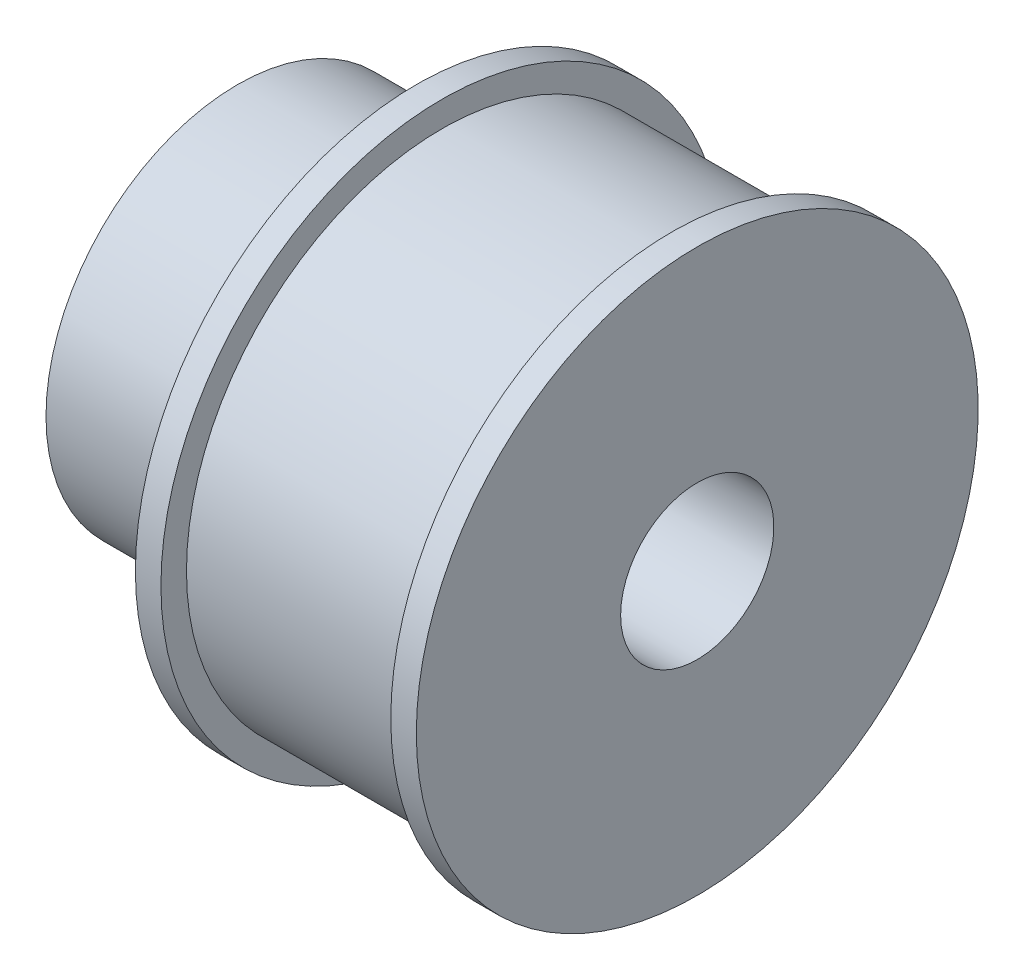
ISO-10303-21;
HEADER;
FILE_DESCRIPTION(('STEP AP214'),'2;1');
FILE_NAME('part.step','',(''),(''),'','','');
FILE_SCHEMA(('AUTOMOTIVE_DESIGN { 1 0 10303 214 1 1 1 1 }'));
ENDSEC;
DATA;
#1=APPLICATION_CONTEXT('core data for automotive mechanical design processes');
#2=APPLICATION_PROTOCOL_DEFINITION('international standard','automotive_design',2000,#1);
#3=PRODUCT_CONTEXT('',#1,'mechanical');
#4=PRODUCT('Part','Part','',(#3));
#5=PRODUCT_RELATED_PRODUCT_CATEGORY('part','',(#4));
#6=PRODUCT_DEFINITION_FORMATION('','',#4);
#7=PRODUCT_DEFINITION_CONTEXT('part definition',#1,'design');
#8=PRODUCT_DEFINITION('design','',#6,#7);
#9=PRODUCT_DEFINITION_SHAPE('','',#8);
#10=(LENGTH_UNIT() NAMED_UNIT(*) SI_UNIT(.MILLI.,.METRE.));
#11=(NAMED_UNIT(*) PLANE_ANGLE_UNIT() SI_UNIT($,.RADIAN.));
#12=(NAMED_UNIT(*) SI_UNIT($,.STERADIAN.) SOLID_ANGLE_UNIT());
#13=UNCERTAINTY_MEASURE_WITH_UNIT(LENGTH_MEASURE(1.E-05),#10,'distance_accuracy_value','');
#14=(GEOMETRIC_REPRESENTATION_CONTEXT(3) GLOBAL_UNCERTAINTY_ASSIGNED_CONTEXT((#13)) GLOBAL_UNIT_ASSIGNED_CONTEXT((#10,
#11,#12)) REPRESENTATION_CONTEXT('',''));
#15=CARTESIAN_POINT('',(0.,0.,0.));
#16=DIRECTION('',(0.,0.,1.));
#17=DIRECTION('',(1.,0.,0.));
#18=AXIS2_PLACEMENT_3D('',#15,#16,#17);
#19=CARTESIAN_POINT('',(0.,0.,0.));
#20=DIRECTION('',(-1.,0.,0.));
#21=DIRECTION('',(0.,0.,1.));
#22=AXIS2_PLACEMENT_3D('',#19,#20,#21);
#23=CYLINDRICAL_SURFACE('',#22,3.);
#24=CARTESIAN_POINT('',(18.,0.,0.));
#25=DIRECTION('',(-1.,0.,0.));
#26=DIRECTION('',(0.,0.,1.));
#27=AXIS2_PLACEMENT_3D('',#24,#25,#26);
#28=CIRCLE('',#27,3.);
#29=CARTESIAN_POINT('',(18.,0.,3.));
#30=VERTEX_POINT('',#29);
#31=EDGE_CURVE('E86',#30,#30,#28,.T.);
#32=ORIENTED_EDGE('',*,*,#31,.F.);
#33=EDGE_LOOP('',(#32));
#34=FACE_BOUND('',#33,.T.);
#35=CARTESIAN_POINT('',(0.,0.,0.));
#36=DIRECTION('',(-1.,0.,0.));
#37=DIRECTION('',(0.,0.,1.));
#38=AXIS2_PLACEMENT_3D('',#35,#36,#37);
#39=CIRCLE('',#38,3.);
#40=CARTESIAN_POINT('',(0.,0.,3.));
#41=VERTEX_POINT('',#40);
#42=EDGE_CURVE('E10',#41,#41,#39,.T.);
#43=ORIENTED_EDGE('',*,*,#42,.T.);
#44=EDGE_LOOP('',(#43));
#45=FACE_BOUND('',#44,.T.);
#46=ADVANCED_FACE('F43',(#34,#45),#23,.F.);
#47=CARTESIAN_POINT('',(0.,0.,-3.));
#48=DIRECTION('',(1.,0.,0.));
#49=DIRECTION('',(0.,0.,-1.));
#50=AXIS2_PLACEMENT_3D('',#47,#48,#49);
#51=PLANE('',#50);
#52=ORIENTED_EDGE('',*,*,#42,.F.);
#53=EDGE_LOOP('',(#52));
#54=FACE_BOUND('',#53,.T.);
#55=CARTESIAN_POINT('',(0.,0.,0.));
#56=DIRECTION('',(-1.,0.,0.));
#57=DIRECTION('',(0.,0.,1.));
#58=AXIS2_PLACEMENT_3D('',#55,#56,#57);
#59=CIRCLE('',#58,7.5);
#60=CARTESIAN_POINT('',(0.,0.,7.5));
#61=VERTEX_POINT('',#60);
#62=EDGE_CURVE('E50',#61,#61,#59,.T.);
#63=ORIENTED_EDGE('',*,*,#62,.T.);
#64=EDGE_LOOP('',(#63));
#65=FACE_BOUND('',#64,.T.);
#66=ADVANCED_FACE('F94',(#54,#65),#51,.F.);
#67=CARTESIAN_POINT('',(0.,0.,0.));
#68=DIRECTION('',(-1.,0.,0.));
#69=DIRECTION('',(0.,0.,1.));
#70=AXIS2_PLACEMENT_3D('',#67,#68,#69);
#71=CYLINDRICAL_SURFACE('',#70,7.5);
#72=ORIENTED_EDGE('',*,*,#62,.F.);
#73=EDGE_LOOP('',(#72));
#74=FACE_BOUND('',#73,.T.);
#75=CARTESIAN_POINT('',(7.,0.,0.));
#76=DIRECTION('',(-1.,0.,0.));
#77=DIRECTION('',(0.,0.,1.));
#78=AXIS2_PLACEMENT_3D('',#75,#76,#77);
#79=CIRCLE('',#78,7.5);
#80=CARTESIAN_POINT('',(7.,0.,7.5));
#81=VERTEX_POINT('',#80);
#82=EDGE_CURVE('E55',#81,#81,#79,.T.);
#83=ORIENTED_EDGE('',*,*,#82,.T.);
#84=EDGE_LOOP('',(#83));
#85=FACE_BOUND('',#84,.T.);
#86=ADVANCED_FACE('F98',(#74,#85),#71,.T.);
#87=CARTESIAN_POINT('',(7.,0.,-7.5));
#88=DIRECTION('',(1.,0.,0.));
#89=DIRECTION('',(0.,0.,-1.));
#90=AXIS2_PLACEMENT_3D('',#87,#88,#89);
#91=PLANE('',#90);
#92=ORIENTED_EDGE('',*,*,#82,.F.);
#93=EDGE_LOOP('',(#92));
#94=FACE_BOUND('',#93,.T.);
#95=CARTESIAN_POINT('',(7.,0.,0.));
#96=DIRECTION('',(-1.,0.,0.));
#97=DIRECTION('',(0.,0.,1.));
#98=AXIS2_PLACEMENT_3D('',#95,#96,#97);
#99=CIRCLE('',#98,11.);
#100=CARTESIAN_POINT('',(7.,0.,11.));
#101=VERTEX_POINT('',#100);
#102=EDGE_CURVE('E60',#101,#101,#99,.T.);
#103=ORIENTED_EDGE('',*,*,#102,.T.);
#104=EDGE_LOOP('',(#103));
#105=FACE_BOUND('',#104,.T.);
#106=ADVANCED_FACE('F103',(#94,#105),#91,.F.);
#107=CARTESIAN_POINT('',(0.,0.,0.));
#108=DIRECTION('',(-1.,0.,0.));
#109=DIRECTION('',(0.,0.,1.));
#110=AXIS2_PLACEMENT_3D('',#107,#108,#109);
#111=CYLINDRICAL_SURFACE('',#110,11.);
#112=ORIENTED_EDGE('',*,*,#102,.F.);
#113=EDGE_LOOP('',(#112));
#114=FACE_BOUND('',#113,.T.);
#115=CARTESIAN_POINT('',(8.,0.,0.));
#116=DIRECTION('',(-1.,0.,0.));
#117=DIRECTION('',(0.,0.,1.));
#118=AXIS2_PLACEMENT_3D('',#115,#116,#117);
#119=CIRCLE('',#118,11.);
#120=CARTESIAN_POINT('',(8.,0.,11.));
#121=VERTEX_POINT('',#120);
#122=EDGE_CURVE('E66',#121,#121,#119,.T.);
#123=ORIENTED_EDGE('',*,*,#122,.T.);
#124=EDGE_LOOP('',(#123));
#125=FACE_BOUND('',#124,.T.);
#126=ADVANCED_FACE('F109',(#114,#125),#111,.T.);
#127=CARTESIAN_POINT('',(8.,0.,-11.));
#128=DIRECTION('',(-1.,0.,0.));
#129=DIRECTION('',(0.,0.,1.));
#130=AXIS2_PLACEMENT_3D('',#127,#128,#129);
#131=PLANE('',#130);
#132=ORIENTED_EDGE('',*,*,#122,.F.);
#133=EDGE_LOOP('',(#132));
#134=FACE_BOUND('',#133,.T.);
#135=CARTESIAN_POINT('',(8.,0.,0.));
#136=DIRECTION('',(-1.,0.,0.));
#137=DIRECTION('',(0.,0.,1.));
#138=AXIS2_PLACEMENT_3D('',#135,#136,#137);
#139=CIRCLE('',#138,10.);
#140=CARTESIAN_POINT('',(8.,0.,10.));
#141=VERTEX_POINT('',#140);
#142=EDGE_CURVE('E70',#141,#141,#139,.T.);
#143=ORIENTED_EDGE('',*,*,#142,.T.);
#144=EDGE_LOOP('',(#143));
#145=FACE_BOUND('',#144,.T.);
#146=ADVANCED_FACE('F113',(#134,#145),#131,.F.);
#147=CARTESIAN_POINT('',(0.,0.,0.));
#148=DIRECTION('',(-1.,0.,0.));
#149=DIRECTION('',(0.,0.,1.));
#150=AXIS2_PLACEMENT_3D('',#147,#148,#149);
#151=CYLINDRICAL_SURFACE('',#150,10.);
#152=ORIENTED_EDGE('',*,*,#142,.F.);
#153=EDGE_LOOP('',(#152));
#154=FACE_BOUND('',#153,.T.);
#155=CARTESIAN_POINT('',(17.,0.,0.));
#156=DIRECTION('',(-1.,0.,0.));
#157=DIRECTION('',(0.,0.,1.));
#158=AXIS2_PLACEMENT_3D('',#155,#156,#157);
#159=CIRCLE('',#158,10.);
#160=CARTESIAN_POINT('',(17.,0.,10.));
#161=VERTEX_POINT('',#160);
#162=EDGE_CURVE('E74',#161,#161,#159,.T.);
#163=ORIENTED_EDGE('',*,*,#162,.T.);
#164=EDGE_LOOP('',(#163));
#165=FACE_BOUND('',#164,.T.);
#166=ADVANCED_FACE('F117',(#154,#165),#151,.T.);
#167=CARTESIAN_POINT('',(17.,0.,-10.));
#168=DIRECTION('',(1.,0.,0.));
#169=DIRECTION('',(0.,0.,-1.));
#170=AXIS2_PLACEMENT_3D('',#167,#168,#169);
#171=PLANE('',#170);
#172=ORIENTED_EDGE('',*,*,#162,.F.);
#173=EDGE_LOOP('',(#172));
#174=FACE_BOUND('',#173,.T.);
#175=CARTESIAN_POINT('',(17.,0.,0.));
#176=DIRECTION('',(-1.,0.,0.));
#177=DIRECTION('',(0.,0.,1.));
#178=AXIS2_PLACEMENT_3D('',#175,#176,#177);
#179=CIRCLE('',#178,11.);
#180=CARTESIAN_POINT('',(17.,0.,11.));
#181=VERTEX_POINT('',#180);
#182=EDGE_CURVE('E78',#181,#181,#179,.T.);
#183=ORIENTED_EDGE('',*,*,#182,.T.);
#184=EDGE_LOOP('',(#183));
#185=FACE_BOUND('',#184,.T.);
#186=ADVANCED_FACE('F121',(#174,#185),#171,.F.);
#187=CARTESIAN_POINT('',(0.,0.,0.));
#188=DIRECTION('',(-1.,0.,0.));
#189=DIRECTION('',(0.,0.,1.));
#190=AXIS2_PLACEMENT_3D('',#187,#188,#189);
#191=CYLINDRICAL_SURFACE('',#190,11.);
#192=ORIENTED_EDGE('',*,*,#182,.F.);
#193=EDGE_LOOP('',(#192));
#194=FACE_BOUND('',#193,.T.);
#195=CARTESIAN_POINT('',(18.,0.,0.));
#196=DIRECTION('',(-1.,0.,0.));
#197=DIRECTION('',(0.,0.,1.));
#198=AXIS2_PLACEMENT_3D('',#195,#196,#197);
#199=CIRCLE('',#198,11.);
#200=CARTESIAN_POINT('',(18.,0.,11.));
#201=VERTEX_POINT('',#200);
#202=EDGE_CURVE('E82',#201,#201,#199,.T.);
#203=ORIENTED_EDGE('',*,*,#202,.T.);
#204=EDGE_LOOP('',(#203));
#205=FACE_BOUND('',#204,.T.);
#206=ADVANCED_FACE('F125',(#194,#205),#191,.T.);
#207=CARTESIAN_POINT('',(18.,0.,-11.));
#208=DIRECTION('',(-1.,0.,0.));
#209=DIRECTION('',(0.,0.,1.));
#210=AXIS2_PLACEMENT_3D('',#207,#208,#209);
#211=PLANE('',#210);
#212=ORIENTED_EDGE('',*,*,#202,.F.);
#213=EDGE_LOOP('',(#212));
#214=FACE_BOUND('',#213,.T.);
#215=ORIENTED_EDGE('',*,*,#31,.T.);
#216=EDGE_LOOP('',(#215));
#217=FACE_BOUND('',#216,.T.);
#218=ADVANCED_FACE('F91',(#214,#217),#211,.F.);
#219=CLOSED_SHELL('',(#46,#66,#86,#106,#126,#146,#166,#186,#206,#218));
#220=MANIFOLD_SOLID_BREP('B2',#219);
#221=ADVANCED_BREP_SHAPE_REPRESENTATION('',(#18,#220),#14);
#222=SHAPE_DEFINITION_REPRESENTATION(#9,#221);
ENDSEC;
END-ISO-10303-21;
